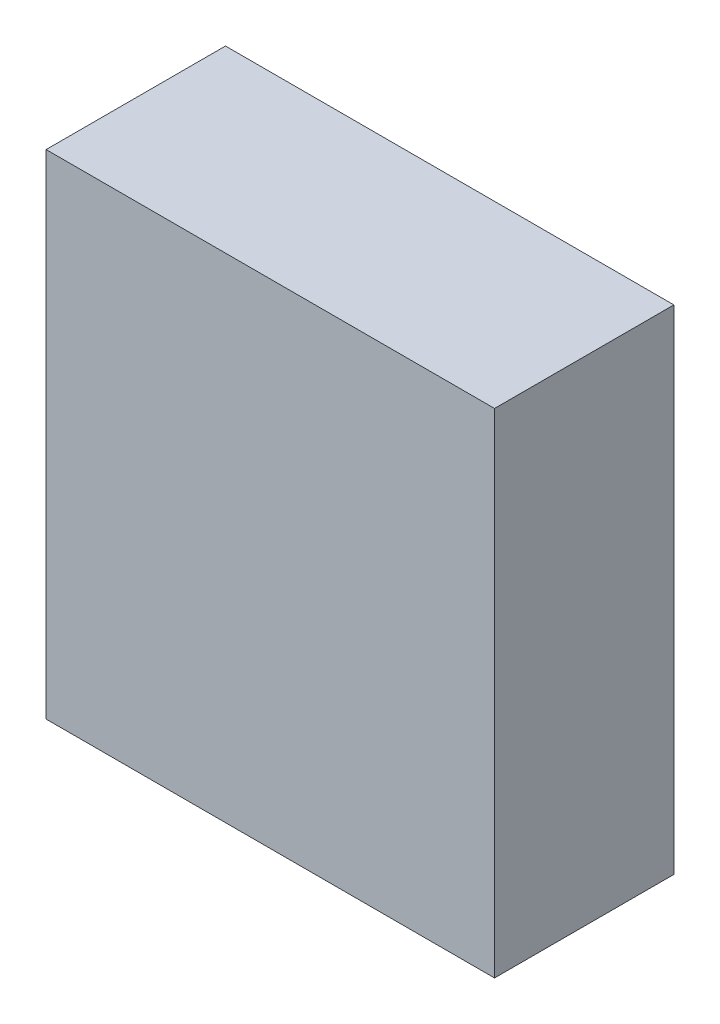
ISO-10303-21;
HEADER;
FILE_DESCRIPTION(('STEP AP214'),'2;1');
FILE_NAME('part.step','',(''),(''),'','','');
FILE_SCHEMA(('AUTOMOTIVE_DESIGN { 1 0 10303 214 1 1 1 1 }'));
ENDSEC;
DATA;
#1=APPLICATION_CONTEXT('core data for automotive mechanical design processes');
#2=APPLICATION_PROTOCOL_DEFINITION('international standard','automotive_design',2000,#1);
#3=PRODUCT_CONTEXT('',#1,'mechanical');
#4=PRODUCT('Part','Part','',(#3));
#5=PRODUCT_RELATED_PRODUCT_CATEGORY('part','',(#4));
#6=PRODUCT_DEFINITION_FORMATION('','',#4);
#7=PRODUCT_DEFINITION_CONTEXT('part definition',#1,'design');
#8=PRODUCT_DEFINITION('design','',#6,#7);
#9=PRODUCT_DEFINITION_SHAPE('','',#8);
#10=(LENGTH_UNIT() NAMED_UNIT(*) SI_UNIT(.MILLI.,.METRE.));
#11=(NAMED_UNIT(*) PLANE_ANGLE_UNIT() SI_UNIT($,.RADIAN.));
#12=(NAMED_UNIT(*) SI_UNIT($,.STERADIAN.) SOLID_ANGLE_UNIT());
#13=UNCERTAINTY_MEASURE_WITH_UNIT(LENGTH_MEASURE(1.E-05),#10,'distance_accuracy_value','');
#14=(GEOMETRIC_REPRESENTATION_CONTEXT(3) GLOBAL_UNCERTAINTY_ASSIGNED_CONTEXT((#13)) GLOBAL_UNIT_ASSIGNED_CONTEXT((#10,
#11,#12)) REPRESENTATION_CONTEXT('',''));
#15=CARTESIAN_POINT('',(0.,0.,0.));
#16=DIRECTION('',(0.,0.,1.));
#17=DIRECTION('',(1.,0.,0.));
#18=AXIS2_PLACEMENT_3D('',#15,#16,#17);
#19=CARTESIAN_POINT('',(120.,560.,-776.));
#20=DIRECTION('',(-1.,0.,0.));
#21=DIRECTION('',(0.,0.,1.));
#22=AXIS2_PLACEMENT_3D('',#19,#20,#21);
#23=PLANE('',#22);
#24=DIRECTION('',(0.,-1.,0.));
#25=VECTOR('',#24,1.);
#26=CARTESIAN_POINT('',(120.,560.,-736.));
#27=LINE('',#26,#25);
#28=CARTESIAN_POINT('',(120.,670.,-736.));
#29=VERTEX_POINT('',#28);
#30=CARTESIAN_POINT('',(120.,560.,-736.));
#31=VERTEX_POINT('',#30);
#32=EDGE_CURVE('E103',#29,#31,#27,.T.);
#33=ORIENTED_EDGE('',*,*,#32,.F.);
#34=DIRECTION('',(0.,0.,1.));
#35=VECTOR('',#34,1.);
#36=CARTESIAN_POINT('',(120.,670.,-776.));
#37=LINE('',#36,#35);
#38=CARTESIAN_POINT('',(120.,670.,-776.));
#39=VERTEX_POINT('',#38);
#40=EDGE_CURVE('E11',#39,#29,#37,.T.);
#41=ORIENTED_EDGE('',*,*,#40,.F.);
#42=DIRECTION('',(0.,-1.,0.));
#43=VECTOR('',#42,1.);
#44=CARTESIAN_POINT('',(120.,560.,-776.));
#45=LINE('',#44,#43);
#46=CARTESIAN_POINT('',(120.,560.,-776.));
#47=VERTEX_POINT('',#46);
#48=EDGE_CURVE('E97',#39,#47,#45,.T.);
#49=ORIENTED_EDGE('',*,*,#48,.T.);
#50=DIRECTION('',(0.,0.,1.));
#51=VECTOR('',#50,1.);
#52=CARTESIAN_POINT('',(120.,560.,-776.));
#53=LINE('',#52,#51);
#54=EDGE_CURVE('E42',#47,#31,#53,.T.);
#55=ORIENTED_EDGE('',*,*,#54,.T.);
#56=EDGE_LOOP('',(#33,#41,#49,#55));
#57=FACE_BOUND('',#56,.T.);
#58=ADVANCED_FACE('F39',(#57),#23,.T.);
#59=CARTESIAN_POINT('',(120.,670.,-776.));
#60=DIRECTION('',(0.,1.,0.));
#61=DIRECTION('',(0.,0.,1.));
#62=AXIS2_PLACEMENT_3D('',#59,#60,#61);
#63=PLANE('',#62);
#64=DIRECTION('',(-1.,0.,0.));
#65=VECTOR('',#64,1.);
#66=CARTESIAN_POINT('',(120.,670.,-736.));
#67=LINE('',#66,#65);
#68=CARTESIAN_POINT('',(220.,670.,-736.));
#69=VERTEX_POINT('',#68);
#70=EDGE_CURVE('E99',#69,#29,#67,.T.);
#71=ORIENTED_EDGE('',*,*,#70,.F.);
#72=DIRECTION('',(0.,0.,1.));
#73=VECTOR('',#72,1.);
#74=CARTESIAN_POINT('',(220.,670.,-776.));
#75=LINE('',#74,#73);
#76=CARTESIAN_POINT('',(220.,670.,-776.));
#77=VERTEX_POINT('',#76);
#78=EDGE_CURVE('E48',#77,#69,#75,.T.);
#79=ORIENTED_EDGE('',*,*,#78,.F.);
#80=DIRECTION('',(-1.,0.,0.));
#81=VECTOR('',#80,1.);
#82=CARTESIAN_POINT('',(120.,670.,-776.));
#83=LINE('',#82,#81);
#84=EDGE_CURVE('E94',#77,#39,#83,.T.);
#85=ORIENTED_EDGE('',*,*,#84,.T.);
#86=ORIENTED_EDGE('',*,*,#40,.T.);
#87=EDGE_LOOP('',(#71,#79,#85,#86));
#88=FACE_BOUND('',#87,.T.);
#89=ADVANCED_FACE('F113',(#88),#63,.T.);
#90=CARTESIAN_POINT('',(220.,560.,-776.));
#91=DIRECTION('',(1.,0.,0.));
#92=DIRECTION('',(0.,0.,-1.));
#93=AXIS2_PLACEMENT_3D('',#90,#91,#92);
#94=PLANE('',#93);
#95=DIRECTION('',(0.,1.,0.));
#96=VECTOR('',#95,1.);
#97=CARTESIAN_POINT('',(220.,560.,-736.));
#98=LINE('',#97,#96);
#99=CARTESIAN_POINT('',(220.,560.,-736.));
#100=VERTEX_POINT('',#99);
#101=EDGE_CURVE('E89',#100,#69,#98,.T.);
#102=ORIENTED_EDGE('',*,*,#101,.F.);
#103=DIRECTION('',(0.,0.,1.));
#104=VECTOR('',#103,1.);
#105=CARTESIAN_POINT('',(220.,560.,-776.));
#106=LINE('',#105,#104);
#107=CARTESIAN_POINT('',(220.,560.,-776.));
#108=VERTEX_POINT('',#107);
#109=EDGE_CURVE('E84',#108,#100,#106,.T.);
#110=ORIENTED_EDGE('',*,*,#109,.F.);
#111=DIRECTION('',(0.,1.,0.));
#112=VECTOR('',#111,1.);
#113=CARTESIAN_POINT('',(220.,560.,-776.));
#114=LINE('',#113,#112);
#115=EDGE_CURVE('E87',#108,#77,#114,.T.);
#116=ORIENTED_EDGE('',*,*,#115,.T.);
#117=ORIENTED_EDGE('',*,*,#78,.T.);
#118=EDGE_LOOP('',(#102,#110,#116,#117));
#119=FACE_BOUND('',#118,.T.);
#120=ADVANCED_FACE('F86',(#119),#94,.T.);
#121=CARTESIAN_POINT('',(120.,560.,-776.));
#122=DIRECTION('',(0.,-1.,0.));
#123=DIRECTION('',(0.,0.,-1.));
#124=AXIS2_PLACEMENT_3D('',#121,#122,#123);
#125=PLANE('',#124);
#126=DIRECTION('',(1.,0.,0.));
#127=VECTOR('',#126,1.);
#128=CARTESIAN_POINT('',(120.,560.,-736.));
#129=LINE('',#128,#127);
#130=EDGE_CURVE('E106',#31,#100,#129,.T.);
#131=ORIENTED_EDGE('',*,*,#130,.F.);
#132=ORIENTED_EDGE('',*,*,#54,.F.);
#133=DIRECTION('',(1.,0.,0.));
#134=VECTOR('',#133,1.);
#135=CARTESIAN_POINT('',(120.,560.,-776.));
#136=LINE('',#135,#134);
#137=EDGE_CURVE('E93',#47,#108,#136,.T.);
#138=ORIENTED_EDGE('',*,*,#137,.T.);
#139=ORIENTED_EDGE('',*,*,#109,.T.);
#140=EDGE_LOOP('',(#131,#132,#138,#139));
#141=FACE_BOUND('',#140,.T.);
#142=ADVANCED_FACE('F96',(#141),#125,.T.);
#143=CARTESIAN_POINT('',(0.,0.,-776.));
#144=DIRECTION('',(0.,0.,-1.));
#145=DIRECTION('',(-1.,0.,0.));
#146=AXIS2_PLACEMENT_3D('',#143,#144,#145);
#147=PLANE('',#146);
#148=ORIENTED_EDGE('',*,*,#48,.F.);
#149=ORIENTED_EDGE('',*,*,#84,.F.);
#150=ORIENTED_EDGE('',*,*,#115,.F.);
#151=ORIENTED_EDGE('',*,*,#137,.F.);
#152=EDGE_LOOP('',(#148,#149,#150,#151));
#153=FACE_BOUND('',#152,.T.);
#154=ADVANCED_FACE('F92',(#153),#147,.T.);
#155=CARTESIAN_POINT('',(0.,0.,-736.));
#156=DIRECTION('',(0.,0.,-1.));
#157=DIRECTION('',(-1.,0.,0.));
#158=AXIS2_PLACEMENT_3D('',#155,#156,#157);
#159=PLANE('',#158);
#160=ORIENTED_EDGE('',*,*,#32,.T.);
#161=ORIENTED_EDGE('',*,*,#130,.T.);
#162=ORIENTED_EDGE('',*,*,#101,.T.);
#163=ORIENTED_EDGE('',*,*,#70,.T.);
#164=EDGE_LOOP('',(#160,#161,#162,#163));
#165=FACE_BOUND('',#164,.T.);
#166=ADVANCED_FACE('F112',(#165),#159,.F.);
#167=CLOSED_SHELL('',(#58,#89,#120,#142,#154,#166));
#168=MANIFOLD_SOLID_BREP('B2',#167);
#169=ADVANCED_BREP_SHAPE_REPRESENTATION('',(#18,#168),#14);
#170=SHAPE_DEFINITION_REPRESENTATION(#9,#169);
ENDSEC;
END-ISO-10303-21;
